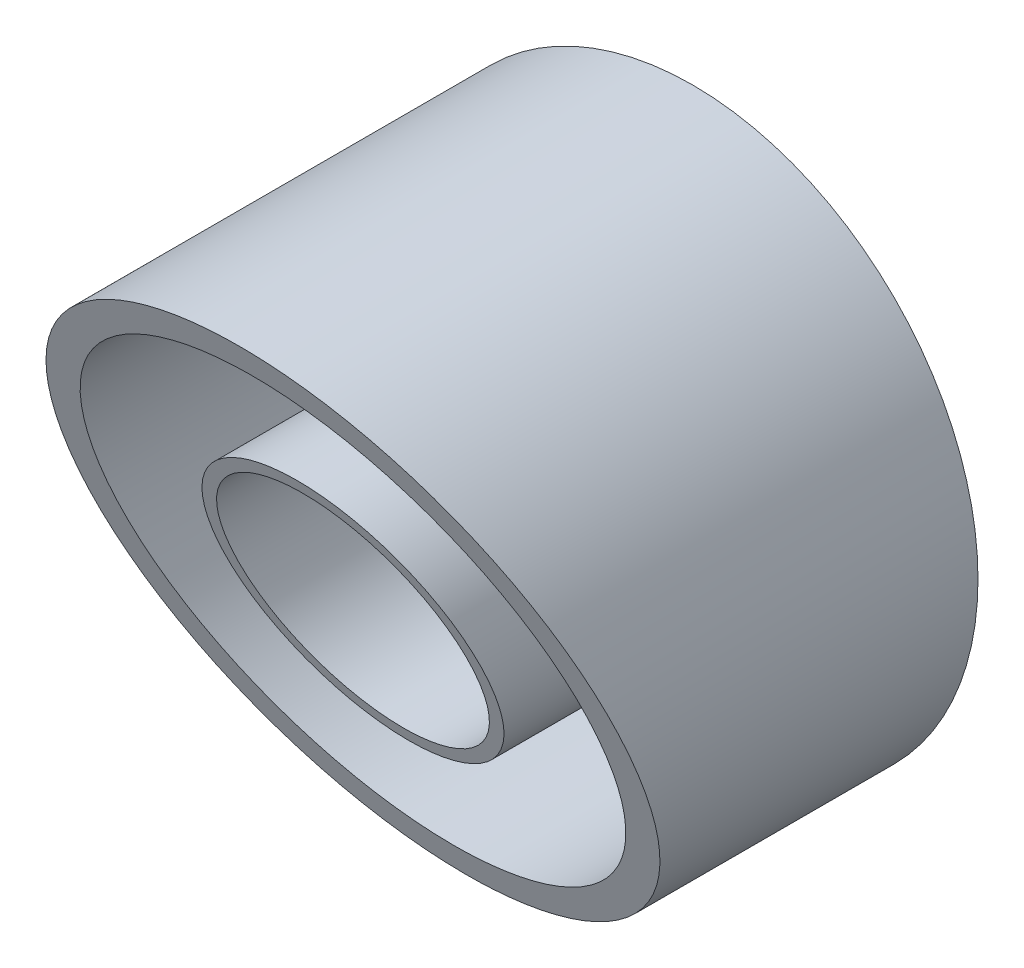
ISO-10303-21;
HEADER;
FILE_DESCRIPTION(('STEP AP214'),'2;1');
FILE_NAME('part.step','',(''),(''),'','','');
FILE_SCHEMA(('AUTOMOTIVE_DESIGN { 1 0 10303 214 1 1 1 1 }'));
ENDSEC;
DATA;
#1=APPLICATION_CONTEXT('core data for automotive mechanical design processes');
#2=APPLICATION_PROTOCOL_DEFINITION('international standard','automotive_design',2000,#1);
#3=PRODUCT_CONTEXT('',#1,'mechanical');
#4=PRODUCT('Part','Part','',(#3));
#5=PRODUCT_RELATED_PRODUCT_CATEGORY('part','',(#4));
#6=PRODUCT_DEFINITION_FORMATION('','',#4);
#7=PRODUCT_DEFINITION_CONTEXT('part definition',#1,'design');
#8=PRODUCT_DEFINITION('design','',#6,#7);
#9=PRODUCT_DEFINITION_SHAPE('','',#8);
#10=(LENGTH_UNIT() NAMED_UNIT(*) SI_UNIT(.MILLI.,.METRE.));
#11=(NAMED_UNIT(*) PLANE_ANGLE_UNIT() SI_UNIT($,.RADIAN.));
#12=(NAMED_UNIT(*) SI_UNIT($,.STERADIAN.) SOLID_ANGLE_UNIT());
#13=UNCERTAINTY_MEASURE_WITH_UNIT(LENGTH_MEASURE(1.E-05),#10,'distance_accuracy_value','');
#14=(GEOMETRIC_REPRESENTATION_CONTEXT(3) GLOBAL_UNCERTAINTY_ASSIGNED_CONTEXT((#13)) GLOBAL_UNIT_ASSIGNED_CONTEXT((#10,
#11,#12)) REPRESENTATION_CONTEXT('',''));
#15=CARTESIAN_POINT('',(0.,0.,0.));
#16=DIRECTION('',(0.,0.,1.));
#17=DIRECTION('',(1.,0.,0.));
#18=AXIS2_PLACEMENT_3D('',#15,#16,#17);
#19=CARTESIAN_POINT('',(0.,0.,0.));
#20=DIRECTION('',(0.,0.,1.));
#21=DIRECTION('',(1.,0.,0.));
#22=AXIS2_PLACEMENT_3D('',#19,#20,#21);
#23=PLANE('',#22);
#24=CARTESIAN_POINT('',(0.,0.,0.));
#25=DIRECTION('',(0.,0.,1.));
#26=DIRECTION('',(1.,0.,0.));
#27=AXIS2_PLACEMENT_3D('',#24,#25,#26);
#28=CIRCLE('',#27,31.5);
#29=CARTESIAN_POINT('',(31.5,0.,0.));
#30=VERTEX_POINT('',#29);
#31=EDGE_CURVE('E13',#30,#30,#28,.T.);
#32=ORIENTED_EDGE('',*,*,#31,.F.);
#33=EDGE_LOOP('',(#32));
#34=FACE_BOUND('',#33,.T.);
#35=CARTESIAN_POINT('',(0.,0.,0.));
#36=DIRECTION('',(0.,0.,1.));
#37=DIRECTION('',(1.,0.,0.));
#38=AXIS2_PLACEMENT_3D('',#35,#36,#37);
#39=CIRCLE('',#38,28.);
#40=CARTESIAN_POINT('',(28.,0.,0.));
#41=VERTEX_POINT('',#40);
#42=EDGE_CURVE('E64',#41,#41,#39,.T.);
#43=ORIENTED_EDGE('',*,*,#42,.T.);
#44=EDGE_LOOP('',(#43));
#45=FACE_BOUND('',#44,.T.);
#46=ADVANCED_FACE('F56',(#34,#45),#23,.F.);
#47=CARTESIAN_POINT('',(0.,0.,50.));
#48=DIRECTION('',(0.,0.,-1.));
#49=DIRECTION('',(-1.,0.,0.));
#50=AXIS2_PLACEMENT_3D('',#47,#48,#49);
#51=CYLINDRICAL_SURFACE('',#50,31.5);
#52=CARTESIAN_POINT('',(0.,0.,37.5));
#53=DIRECTION('',(0.,0.36884552030541,-0.929490711169634));
#54=DIRECTION('',(0.,-0.929490711169634,-0.36884552030541));
#55=AXIS2_PLACEMENT_3D('',#52,#53,#54);
#56=ELLIPSE('',#55,33.8895264056611,31.5);
#57=CARTESIAN_POINT('',(0.,-31.5,25.));
#58=VERTEX_POINT('',#57);
#59=EDGE_CURVE('E68',#58,#58,#56,.T.);
#60=ORIENTED_EDGE('',*,*,#59,.T.);
#61=EDGE_LOOP('',(#60));
#62=FACE_BOUND('',#61,.T.);
#63=ORIENTED_EDGE('',*,*,#31,.T.);
#64=EDGE_LOOP('',(#63));
#65=FACE_BOUND('',#64,.T.);
#66=ADVANCED_FACE('F58',(#62,#65),#51,.T.);
#67=CARTESIAN_POINT('',(0.,0.,50.));
#68=DIRECTION('',(0.,0.,-1.));
#69=DIRECTION('',(-1.,0.,0.));
#70=AXIS2_PLACEMENT_3D('',#67,#68,#69);
#71=CYLINDRICAL_SURFACE('',#70,28.);
#72=CARTESIAN_POINT('',(0.,0.,37.5));
#73=DIRECTION('',(0.,0.36884552030541,-0.929490711169634));
#74=DIRECTION('',(0.,-0.929490711169634,-0.36884552030541));
#75=AXIS2_PLACEMENT_3D('',#72,#73,#74);
#76=ELLIPSE('',#75,30.1240234716987,28.);
#77=CARTESIAN_POINT('',(0.,-28.,26.3888888888889));
#78=VERTEX_POINT('',#77);
#79=EDGE_CURVE('E60',#78,#78,#76,.T.);
#80=ORIENTED_EDGE('',*,*,#79,.F.);
#81=EDGE_LOOP('',(#80));
#82=FACE_BOUND('',#81,.T.);
#83=ORIENTED_EDGE('',*,*,#42,.F.);
#84=EDGE_LOOP('',(#83));
#85=FACE_BOUND('',#84,.T.);
#86=ADVANCED_FACE('F80',(#82,#85),#71,.F.);
#87=CARTESIAN_POINT('',(2500.,31.5,50.));
#88=DIRECTION('',(0.,0.36884552030541,-0.929490711169634));
#89=DIRECTION('',(0.,0.929490711169634,0.36884552030541));
#90=AXIS2_PLACEMENT_3D('',#87,#88,#89);
#91=PLANE('',#90);
#92=ORIENTED_EDGE('',*,*,#79,.T.);
#93=EDGE_LOOP('',(#92));
#94=FACE_BOUND('',#93,.T.);
#95=ORIENTED_EDGE('',*,*,#59,.F.);
#96=EDGE_LOOP('',(#95));
#97=FACE_BOUND('',#96,.T.);
#98=ADVANCED_FACE('F77',(#94,#97),#91,.F.);
#99=CLOSED_SHELL('',(#46,#66,#86,#98));
#100=MANIFOLD_SOLID_BREP('B2',#99);
#101=CARTESIAN_POINT('',(0.,0.,50.));
#102=DIRECTION('',(0.,0.,-1.));
#103=DIRECTION('',(-1.,0.,0.));
#104=AXIS2_PLACEMENT_3D('',#101,#102,#103);
#105=CYLINDRICAL_SURFACE('',#104,15.5);
#106=CARTESIAN_POINT('',(0.,0.,37.5));
#107=DIRECTION('',(0.,0.36884552030541,-0.929490711169634));
#108=DIRECTION('',(0.,-0.929490711169634,-0.36884552030541));
#109=AXIS2_PLACEMENT_3D('',#106,#107,#108);
#110=ELLIPSE('',#109,16.6757987075475,15.5);
#111=CARTESIAN_POINT('',(0.,-15.5,31.3492063492064));
#112=VERTEX_POINT('',#111);
#113=EDGE_CURVE('E133',#112,#112,#110,.T.);
#114=ORIENTED_EDGE('',*,*,#113,.T.);
#115=EDGE_LOOP('',(#114));
#116=FACE_BOUND('',#115,.T.);
#117=CARTESIAN_POINT('',(0.,0.,3.));
#118=DIRECTION('',(0.,0.,-1.));
#119=DIRECTION('',(-1.,0.,0.));
#120=AXIS2_PLACEMENT_3D('',#117,#118,#119);
#121=CIRCLE('',#120,15.5);
#122=CARTESIAN_POINT('',(-15.5,0.,3.));
#123=VERTEX_POINT('',#122);
#124=EDGE_CURVE('E55',#123,#123,#121,.T.);
#125=ORIENTED_EDGE('',*,*,#124,.F.);
#126=EDGE_LOOP('',(#125));
#127=FACE_BOUND('',#126,.T.);
#128=ADVANCED_FACE('F123',(#116,#127),#105,.T.);
#129=CARTESIAN_POINT('',(0.,0.,0.));
#130=DIRECTION('',(0.,0.,1.));
#131=DIRECTION('',(1.,0.,0.));
#132=AXIS2_PLACEMENT_3D('',#129,#130,#131);
#133=PLANE('',#132);
#134=CARTESIAN_POINT('',(0.,0.,0.));
#135=DIRECTION('',(0.,0.,1.));
#136=DIRECTION('',(1.,0.,0.));
#137=AXIS2_PLACEMENT_3D('',#134,#135,#136);
#138=CIRCLE('',#137,14.);
#139=CARTESIAN_POINT('',(14.,0.,0.));
#140=VERTEX_POINT('',#139);
#141=EDGE_CURVE('E129',#140,#140,#138,.T.);
#142=ORIENTED_EDGE('',*,*,#141,.T.);
#143=EDGE_LOOP('',(#142));
#144=FACE_BOUND('',#143,.T.);
#145=CARTESIAN_POINT('',(0.,0.,0.));
#146=DIRECTION('',(0.,0.,-1.));
#147=DIRECTION('',(-1.,0.,0.));
#148=AXIS2_PLACEMENT_3D('',#145,#146,#147);
#149=CIRCLE('',#148,27.9625158442028);
#150=CARTESIAN_POINT('',(-27.9625158442028,0.,0.));
#151=VERTEX_POINT('',#150);
#152=EDGE_CURVE('E146',#151,#151,#149,.T.);
#153=ORIENTED_EDGE('',*,*,#152,.T.);
#154=EDGE_LOOP('',(#153));
#155=FACE_BOUND('',#154,.T.);
#156=ADVANCED_FACE('F153',(#144,#155),#133,.F.);
#157=CARTESIAN_POINT('',(0.,0.,50.));
#158=DIRECTION('',(0.,0.,-1.));
#159=DIRECTION('',(-1.,0.,0.));
#160=AXIS2_PLACEMENT_3D('',#157,#158,#159);
#161=CYLINDRICAL_SURFACE('',#160,14.);
#162=CARTESIAN_POINT('',(0.,0.,37.5));
#163=DIRECTION('',(0.,0.36884552030541,-0.929490711169634));
#164=DIRECTION('',(0.,-0.929490711169634,-0.36884552030541));
#165=AXIS2_PLACEMENT_3D('',#162,#163,#164);
#166=ELLIPSE('',#165,15.0620117358494,14.);
#167=CARTESIAN_POINT('',(0.,-14.,31.9444444444444));
#168=VERTEX_POINT('',#167);
#169=EDGE_CURVE('E138',#168,#168,#166,.T.);
#170=ORIENTED_EDGE('',*,*,#169,.F.);
#171=EDGE_LOOP('',(#170));
#172=FACE_BOUND('',#171,.T.);
#173=ORIENTED_EDGE('',*,*,#141,.F.);
#174=EDGE_LOOP('',(#173));
#175=FACE_BOUND('',#174,.T.);
#176=ADVANCED_FACE('F165',(#172,#175),#161,.F.);
#177=CARTESIAN_POINT('',(2500.,31.5,50.));
#178=DIRECTION('',(0.,0.36884552030541,-0.929490711169634));
#179=DIRECTION('',(0.,0.929490711169634,0.36884552030541));
#180=AXIS2_PLACEMENT_3D('',#177,#178,#179);
#181=PLANE('',#180);
#182=ORIENTED_EDGE('',*,*,#169,.T.);
#183=EDGE_LOOP('',(#182));
#184=FACE_BOUND('',#183,.T.);
#185=ORIENTED_EDGE('',*,*,#113,.F.);
#186=EDGE_LOOP('',(#185));
#187=FACE_BOUND('',#186,.T.);
#188=ADVANCED_FACE('F158',(#184,#187),#181,.F.);
#189=CARTESIAN_POINT('',(0.,0.,3.));
#190=DIRECTION('',(0.,0.,-1.));
#191=DIRECTION('',(-1.,0.,0.));
#192=AXIS2_PLACEMENT_3D('',#189,#190,#191);
#193=CYLINDRICAL_SURFACE('',#192,27.9625158442028);
#194=CARTESIAN_POINT('',(0.,0.,3.));
#195=DIRECTION('',(0.,0.,-1.));
#196=DIRECTION('',(-1.,0.,0.));
#197=AXIS2_PLACEMENT_3D('',#194,#195,#196);
#198=CIRCLE('',#197,27.9625158442028);
#199=CARTESIAN_POINT('',(-27.9625158442028,0.,3.));
#200=VERTEX_POINT('',#199);
#201=EDGE_CURVE('E142',#200,#200,#198,.T.);
#202=ORIENTED_EDGE('',*,*,#201,.T.);
#203=EDGE_LOOP('',(#202));
#204=FACE_BOUND('',#203,.T.);
#205=ORIENTED_EDGE('',*,*,#152,.F.);
#206=EDGE_LOOP('',(#205));
#207=FACE_BOUND('',#206,.T.);
#208=ADVANCED_FACE('F155',(#204,#207),#193,.T.);
#209=CARTESIAN_POINT('',(0.,0.,3.));
#210=DIRECTION('',(0.,0.,-1.));
#211=DIRECTION('',(-1.,0.,0.));
#212=AXIS2_PLACEMENT_3D('',#209,#210,#211);
#213=PLANE('',#212);
#214=ORIENTED_EDGE('',*,*,#124,.T.);
#215=EDGE_LOOP('',(#214));
#216=FACE_BOUND('',#215,.T.);
#217=ORIENTED_EDGE('',*,*,#201,.F.);
#218=EDGE_LOOP('',(#217));
#219=FACE_BOUND('',#218,.T.);
#220=ADVANCED_FACE('F157',(#216,#219),#213,.F.);
#221=CLOSED_SHELL('',(#128,#156,#176,#188,#208,#220));
#222=MANIFOLD_SOLID_BREP('B8',#221);
#223=ADVANCED_BREP_SHAPE_REPRESENTATION('',(#18,#100,#222),#14);
#224=SHAPE_DEFINITION_REPRESENTATION(#9,#223);
ENDSEC;
END-ISO-10303-21;
